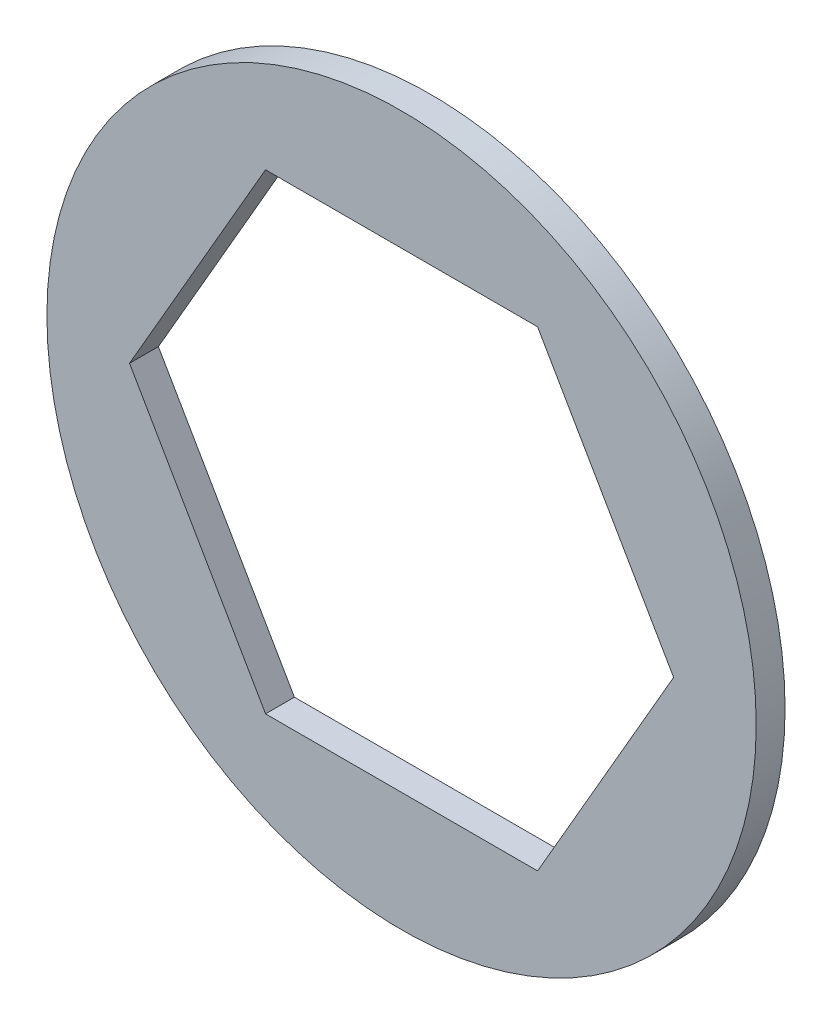
ISO-10303-21;
HEADER;
FILE_DESCRIPTION(('STEP AP214'),'2;1');
FILE_NAME('part.step','',(''),(''),'','','');
FILE_SCHEMA(('AUTOMOTIVE_DESIGN { 1 0 10303 214 1 1 1 1 }'));
ENDSEC;
DATA;
#1=APPLICATION_CONTEXT('core data for automotive mechanical design processes');
#2=APPLICATION_PROTOCOL_DEFINITION('international standard','automotive_design',2000,#1);
#3=PRODUCT_CONTEXT('',#1,'mechanical');
#4=PRODUCT('Part','Part','',(#3));
#5=PRODUCT_RELATED_PRODUCT_CATEGORY('part','',(#4));
#6=PRODUCT_DEFINITION_FORMATION('','',#4);
#7=PRODUCT_DEFINITION_CONTEXT('part definition',#1,'design');
#8=PRODUCT_DEFINITION('design','',#6,#7);
#9=PRODUCT_DEFINITION_SHAPE('','',#8);
#10=(LENGTH_UNIT() NAMED_UNIT(*) SI_UNIT(.MILLI.,.METRE.));
#11=(NAMED_UNIT(*) PLANE_ANGLE_UNIT() SI_UNIT($,.RADIAN.));
#12=(NAMED_UNIT(*) SI_UNIT($,.STERADIAN.) SOLID_ANGLE_UNIT());
#13=UNCERTAINTY_MEASURE_WITH_UNIT(LENGTH_MEASURE(1.E-05),#10,'distance_accuracy_value','');
#14=(GEOMETRIC_REPRESENTATION_CONTEXT(3) GLOBAL_UNCERTAINTY_ASSIGNED_CONTEXT((#13)) GLOBAL_UNIT_ASSIGNED_CONTEXT((#10,
#11,#12)) REPRESENTATION_CONTEXT('',''));
#15=CARTESIAN_POINT('',(0.,0.,0.));
#16=DIRECTION('',(0.,0.,1.));
#17=DIRECTION('',(1.,0.,0.));
#18=AXIS2_PLACEMENT_3D('',#15,#16,#17);
#19=CARTESIAN_POINT('',(0.,0.,0.79375));
#20=DIRECTION('',(0.,0.,-1.));
#21=DIRECTION('',(-1.,0.,0.));
#22=AXIS2_PLACEMENT_3D('',#19,#20,#21);
#23=CYLINDRICAL_SURFACE('',#22,9.75);
#24=CARTESIAN_POINT('',(0.,0.,-0.79375));
#25=DIRECTION('',(0.,0.,-1.));
#26=DIRECTION('',(-1.,0.,0.));
#27=AXIS2_PLACEMENT_3D('',#24,#25,#26);
#28=CIRCLE('',#27,9.75);
#29=CARTESIAN_POINT('',(-9.75,0.,-0.79375));
#30=VERTEX_POINT('',#29);
#31=EDGE_CURVE('E111',#30,#30,#28,.F.);
#32=ORIENTED_EDGE('',*,*,#31,.T.);
#33=EDGE_LOOP('',(#32));
#34=FACE_BOUND('',#33,.T.);
#35=CARTESIAN_POINT('',(0.,0.,0.));
#36=DIRECTION('',(0.,0.,1.));
#37=DIRECTION('',(1.,0.,0.));
#38=AXIS2_PLACEMENT_3D('',#35,#36,#37);
#39=CIRCLE('',#38,9.75);
#40=CARTESIAN_POINT('',(9.75,0.,0.));
#41=VERTEX_POINT('',#40);
#42=EDGE_CURVE('E95',#41,#41,#39,.F.);
#43=ORIENTED_EDGE('',*,*,#42,.T.);
#44=EDGE_LOOP('',(#43));
#45=FACE_BOUND('',#44,.T.);
#46=ADVANCED_FACE('F41',(#34,#45),#23,.T.);
#47=CARTESIAN_POINT('',(-7.47899538708241,0.,0.79375));
#48=DIRECTION('',(0.866025403784439,0.5,0.));
#49=DIRECTION('',(-0.5,0.866025403784439,0.));
#50=AXIS2_PLACEMENT_3D('',#47,#48,#49);
#51=PLANE('',#50);
#52=DIRECTION('',(0.,0.,1.));
#53=VECTOR('',#52,1.);
#54=CARTESIAN_POINT('',(-7.47899538708241,0.,0.79375));
#55=LINE('',#54,#53);
#56=CARTESIAN_POINT('',(-7.47899538708241,0.,0.));
#57=VERTEX_POINT('',#56);
#58=CARTESIAN_POINT('',(-7.47899538708241,0.,-0.79375));
#59=VERTEX_POINT('',#58);
#60=EDGE_CURVE('E84',#57,#59,#55,.F.);
#61=ORIENTED_EDGE('',*,*,#60,.F.);
#62=DIRECTION('',(0.5,-0.866025403784439,0.));
#63=VECTOR('',#62,1.);
#64=CARTESIAN_POINT('',(-7.47899538708241,0.,0.));
#65=LINE('',#64,#63);
#66=CARTESIAN_POINT('',(-3.73949769354121,-6.477,0.));
#67=VERTEX_POINT('',#66);
#68=EDGE_CURVE('E137',#57,#67,#65,.T.);
#69=ORIENTED_EDGE('',*,*,#68,.T.);
#70=DIRECTION('',(0.,0.,1.));
#71=VECTOR('',#70,1.);
#72=CARTESIAN_POINT('',(-3.73949769354121,-6.477,0.79375));
#73=LINE('',#72,#71);
#74=CARTESIAN_POINT('',(-3.73949769354121,-6.477,-0.79375));
#75=VERTEX_POINT('',#74);
#76=EDGE_CURVE('E110',#75,#67,#73,.T.);
#77=ORIENTED_EDGE('',*,*,#76,.F.);
#78=DIRECTION('',(-0.5,0.866025403784439,0.));
#79=VECTOR('',#78,1.);
#80=CARTESIAN_POINT('',(-3.73949769354121,-6.477,-0.79375));
#81=LINE('',#80,#79);
#82=EDGE_CURVE('E102',#75,#59,#81,.T.);
#83=ORIENTED_EDGE('',*,*,#82,.T.);
#84=EDGE_LOOP('',(#61,#69,#77,#83));
#85=FACE_BOUND('',#84,.T.);
#86=ADVANCED_FACE('F108',(#85),#51,.T.);
#87=CARTESIAN_POINT('',(-3.73949769354121,6.477,0.79375));
#88=DIRECTION('',(0.866025403784439,-0.5,0.));
#89=DIRECTION('',(0.5,0.866025403784439,0.));
#90=AXIS2_PLACEMENT_3D('',#87,#88,#89);
#91=PLANE('',#90);
#92=DIRECTION('',(0.,0.,1.));
#93=VECTOR('',#92,1.);
#94=CARTESIAN_POINT('',(-3.73949769354121,6.477,0.79375));
#95=LINE('',#94,#93);
#96=CARTESIAN_POINT('',(-3.73949769354121,6.477,0.));
#97=VERTEX_POINT('',#96);
#98=CARTESIAN_POINT('',(-3.73949769354121,6.477,-0.79375));
#99=VERTEX_POINT('',#98);
#100=EDGE_CURVE('E94',#97,#99,#95,.F.);
#101=ORIENTED_EDGE('',*,*,#100,.F.);
#102=DIRECTION('',(-0.5,-0.866025403784439,0.));
#103=VECTOR('',#102,1.);
#104=CARTESIAN_POINT('',(-3.73949769354121,6.477,0.));
#105=LINE('',#104,#103);
#106=EDGE_CURVE('E90',#97,#57,#105,.T.);
#107=ORIENTED_EDGE('',*,*,#106,.T.);
#108=ORIENTED_EDGE('',*,*,#60,.T.);
#109=DIRECTION('',(0.5,0.866025403784439,0.));
#110=VECTOR('',#109,1.);
#111=CARTESIAN_POINT('',(-7.47899538708241,0.,-0.79375));
#112=LINE('',#111,#110);
#113=EDGE_CURVE('E88',#59,#99,#112,.T.);
#114=ORIENTED_EDGE('',*,*,#113,.T.);
#115=EDGE_LOOP('',(#101,#107,#108,#114));
#116=FACE_BOUND('',#115,.T.);
#117=ADVANCED_FACE('F87',(#116),#91,.T.);
#118=CARTESIAN_POINT('',(3.7394976935412,6.477,0.79375));
#119=DIRECTION('',(0.,-1.,0.));
#120=DIRECTION('',(1.,0.,0.));
#121=AXIS2_PLACEMENT_3D('',#118,#119,#120);
#122=PLANE('',#121);
#123=DIRECTION('',(0.,0.,1.));
#124=VECTOR('',#123,1.);
#125=CARTESIAN_POINT('',(3.7394976935412,6.47700000000001,0.79375));
#126=LINE('',#125,#124);
#127=CARTESIAN_POINT('',(3.7394976935412,6.477,0.));
#128=VERTEX_POINT('',#127);
#129=CARTESIAN_POINT('',(3.7394976935412,6.477,-0.79375));
#130=VERTEX_POINT('',#129);
#131=EDGE_CURVE('E120',#128,#130,#126,.F.);
#132=ORIENTED_EDGE('',*,*,#131,.F.);
#133=DIRECTION('',(-1.,0.,0.));
#134=VECTOR('',#133,1.);
#135=CARTESIAN_POINT('',(3.7394976935412,6.477,0.));
#136=LINE('',#135,#134);
#137=EDGE_CURVE('E128',#128,#97,#136,.T.);
#138=ORIENTED_EDGE('',*,*,#137,.T.);
#139=ORIENTED_EDGE('',*,*,#100,.T.);
#140=DIRECTION('',(1.,0.,0.));
#141=VECTOR('',#140,1.);
#142=CARTESIAN_POINT('',(0.,6.477,-0.79375));
#143=LINE('',#142,#141);
#144=EDGE_CURVE('E106',#99,#130,#143,.T.);
#145=ORIENTED_EDGE('',*,*,#144,.T.);
#146=EDGE_LOOP('',(#132,#138,#139,#145));
#147=FACE_BOUND('',#146,.T.);
#148=ADVANCED_FACE('F125',(#147),#122,.T.);
#149=CARTESIAN_POINT('',(7.47899538708241,0.,0.79375));
#150=DIRECTION('',(-0.866025403784439,-0.5,0.));
#151=DIRECTION('',(0.5,-0.866025403784439,0.));
#152=AXIS2_PLACEMENT_3D('',#149,#150,#151);
#153=PLANE('',#152);
#154=DIRECTION('',(0.,0.,1.));
#155=VECTOR('',#154,1.);
#156=CARTESIAN_POINT('',(7.47899538708242,0.,0.79375));
#157=LINE('',#156,#155);
#158=CARTESIAN_POINT('',(7.47899538708242,0.,0.));
#159=VERTEX_POINT('',#158);
#160=CARTESIAN_POINT('',(7.47899538708241,0.,-0.79375));
#161=VERTEX_POINT('',#160);
#162=EDGE_CURVE('E118',#159,#161,#157,.F.);
#163=ORIENTED_EDGE('',*,*,#162,.F.);
#164=DIRECTION('',(-0.5,0.866025403784439,0.));
#165=VECTOR('',#164,1.);
#166=CARTESIAN_POINT('',(7.47899538708241,0.,0.));
#167=LINE('',#166,#165);
#168=EDGE_CURVE('E154',#159,#128,#167,.T.);
#169=ORIENTED_EDGE('',*,*,#168,.T.);
#170=ORIENTED_EDGE('',*,*,#131,.T.);
#171=DIRECTION('',(0.5,-0.866025403784438,0.));
#172=VECTOR('',#171,1.);
#173=CARTESIAN_POINT('',(3.7394976935412,6.477,-0.79375));
#174=LINE('',#173,#172);
#175=EDGE_CURVE('E143',#130,#161,#174,.T.);
#176=ORIENTED_EDGE('',*,*,#175,.T.);
#177=EDGE_LOOP('',(#163,#169,#170,#176));
#178=FACE_BOUND('',#177,.T.);
#179=ADVANCED_FACE('F150',(#178),#153,.T.);
#180=CARTESIAN_POINT('',(3.73949769354121,-6.477,0.79375));
#181=DIRECTION('',(-0.866025403784439,0.5,0.));
#182=DIRECTION('',(-0.5,-0.866025403784439,0.));
#183=AXIS2_PLACEMENT_3D('',#180,#181,#182);
#184=PLANE('',#183);
#185=DIRECTION('',(0.,0.,1.));
#186=VECTOR('',#185,1.);
#187=CARTESIAN_POINT('',(3.73949769354121,-6.477,0.79375));
#188=LINE('',#187,#186);
#189=CARTESIAN_POINT('',(3.73949769354121,-6.477,0.));
#190=VERTEX_POINT('',#189);
#191=CARTESIAN_POINT('',(3.73949769354121,-6.477,-0.79375));
#192=VERTEX_POINT('',#191);
#193=EDGE_CURVE('E62',#190,#192,#188,.F.);
#194=ORIENTED_EDGE('',*,*,#193,.F.);
#195=DIRECTION('',(0.5,0.866025403784439,0.));
#196=VECTOR('',#195,1.);
#197=CARTESIAN_POINT('',(3.73949769354121,-6.477,0.));
#198=LINE('',#197,#196);
#199=EDGE_CURVE('E55',#190,#159,#198,.T.);
#200=ORIENTED_EDGE('',*,*,#199,.T.);
#201=ORIENTED_EDGE('',*,*,#162,.T.);
#202=DIRECTION('',(-0.5,-0.866025403784439,0.));
#203=VECTOR('',#202,1.);
#204=CARTESIAN_POINT('',(7.47899538708241,0.,-0.79375));
#205=LINE('',#204,#203);
#206=EDGE_CURVE('E141',#161,#192,#205,.T.);
#207=ORIENTED_EDGE('',*,*,#206,.T.);
#208=EDGE_LOOP('',(#194,#200,#201,#207));
#209=FACE_BOUND('',#208,.T.);
#210=ADVANCED_FACE('F153',(#209),#184,.T.);
#211=CARTESIAN_POINT('',(-3.73949769354121,-6.477,0.79375));
#212=DIRECTION('',(0.,1.,0.));
#213=DIRECTION('',(0.,0.,1.));
#214=AXIS2_PLACEMENT_3D('',#211,#212,#213);
#215=PLANE('',#214);
#216=ORIENTED_EDGE('',*,*,#76,.T.);
#217=DIRECTION('',(1.,0.,0.));
#218=VECTOR('',#217,1.);
#219=CARTESIAN_POINT('',(-3.73949769354121,-6.477,0.));
#220=LINE('',#219,#218);
#221=EDGE_CURVE('E11',#67,#190,#220,.T.);
#222=ORIENTED_EDGE('',*,*,#221,.T.);
#223=ORIENTED_EDGE('',*,*,#193,.T.);
#224=DIRECTION('',(1.,0.,0.));
#225=VECTOR('',#224,1.);
#226=CARTESIAN_POINT('',(0.,-6.477,-0.79375));
#227=LINE('',#226,#225);
#228=EDGE_CURVE('E48',#192,#75,#227,.F.);
#229=ORIENTED_EDGE('',*,*,#228,.T.);
#230=EDGE_LOOP('',(#216,#222,#223,#229));
#231=FACE_BOUND('',#230,.T.);
#232=ADVANCED_FACE('F139',(#231),#215,.T.);
#233=CARTESIAN_POINT('',(0.,0.,-0.79375));
#234=DIRECTION('',(0.,0.,1.));
#235=DIRECTION('',(1.,0.,0.));
#236=AXIS2_PLACEMENT_3D('',#233,#234,#235);
#237=PLANE('',#236);
#238=ORIENTED_EDGE('',*,*,#206,.F.);
#239=ORIENTED_EDGE('',*,*,#175,.F.);
#240=ORIENTED_EDGE('',*,*,#144,.F.);
#241=ORIENTED_EDGE('',*,*,#113,.F.);
#242=ORIENTED_EDGE('',*,*,#82,.F.);
#243=ORIENTED_EDGE('',*,*,#228,.F.);
#244=EDGE_LOOP('',(#238,#239,#240,#241,#242,#243));
#245=FACE_BOUND('',#244,.T.);
#246=ORIENTED_EDGE('',*,*,#31,.F.);
#247=EDGE_LOOP('',(#246));
#248=FACE_BOUND('',#247,.T.);
#249=ADVANCED_FACE('F100',(#245,#248),#237,.F.);
#250=CARTESIAN_POINT('',(0.,0.,0.));
#251=DIRECTION('',(0.,0.,1.));
#252=DIRECTION('',(1.,0.,0.));
#253=AXIS2_PLACEMENT_3D('',#250,#251,#252);
#254=PLANE('',#253);
#255=ORIENTED_EDGE('',*,*,#42,.F.);
#256=EDGE_LOOP('',(#255));
#257=FACE_BOUND('',#256,.T.);
#258=ORIENTED_EDGE('',*,*,#106,.F.);
#259=ORIENTED_EDGE('',*,*,#137,.F.);
#260=ORIENTED_EDGE('',*,*,#168,.F.);
#261=ORIENTED_EDGE('',*,*,#199,.F.);
#262=ORIENTED_EDGE('',*,*,#221,.F.);
#263=ORIENTED_EDGE('',*,*,#68,.F.);
#264=EDGE_LOOP('',(#258,#259,#260,#261,#262,#263));
#265=FACE_BOUND('',#264,.T.);
#266=ADVANCED_FACE('F136',(#257,#265),#254,.T.);
#267=CLOSED_SHELL('',(#46,#86,#117,#148,#179,#210,#232,#249,#266));
#268=MANIFOLD_SOLID_BREP('B2',#267);
#269=ADVANCED_BREP_SHAPE_REPRESENTATION('',(#18,#268),#14);
#270=SHAPE_DEFINITION_REPRESENTATION(#9,#269);
ENDSEC;
END-ISO-10303-21;
